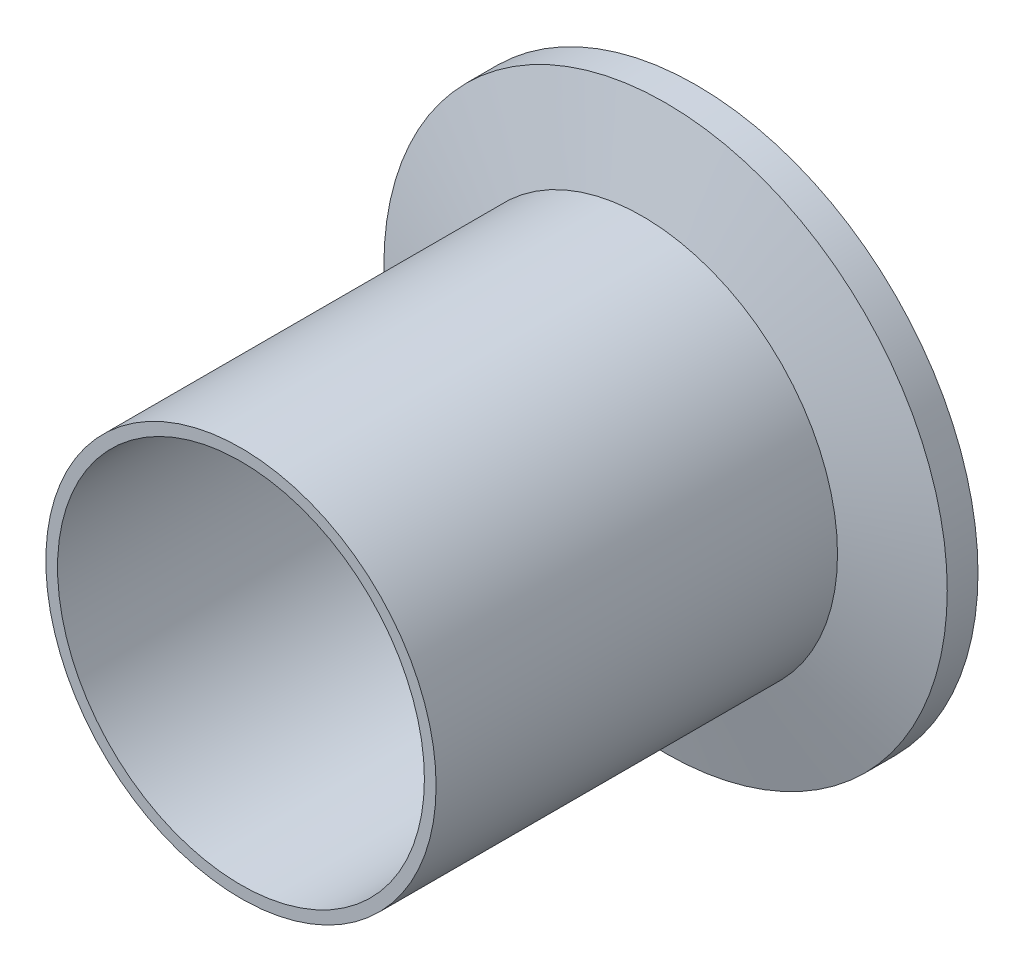
ISO-10303-21;
HEADER;
FILE_DESCRIPTION(('STEP AP214'),'2;1');
FILE_NAME('part.step','',(''),(''),'','','');
FILE_SCHEMA(('AUTOMOTIVE_DESIGN { 1 0 10303 214 1 1 1 1 }'));
ENDSEC;
DATA;
#1=APPLICATION_CONTEXT('core data for automotive mechanical design processes');
#2=APPLICATION_PROTOCOL_DEFINITION('international standard','automotive_design',2000,#1);
#3=PRODUCT_CONTEXT('',#1,'mechanical');
#4=PRODUCT('Part','Part','',(#3));
#5=PRODUCT_RELATED_PRODUCT_CATEGORY('part','',(#4));
#6=PRODUCT_DEFINITION_FORMATION('','',#4);
#7=PRODUCT_DEFINITION_CONTEXT('part definition',#1,'design');
#8=PRODUCT_DEFINITION('design','',#6,#7);
#9=PRODUCT_DEFINITION_SHAPE('','',#8);
#10=(LENGTH_UNIT() NAMED_UNIT(*) SI_UNIT(.MILLI.,.METRE.));
#11=(NAMED_UNIT(*) PLANE_ANGLE_UNIT() SI_UNIT($,.RADIAN.));
#12=(NAMED_UNIT(*) SI_UNIT($,.STERADIAN.) SOLID_ANGLE_UNIT());
#13=UNCERTAINTY_MEASURE_WITH_UNIT(LENGTH_MEASURE(1.E-05),#10,'distance_accuracy_value','');
#14=(GEOMETRIC_REPRESENTATION_CONTEXT(3) GLOBAL_UNCERTAINTY_ASSIGNED_CONTEXT((#13)) GLOBAL_UNIT_ASSIGNED_CONTEXT((#10,
#11,#12)) REPRESENTATION_CONTEXT('',''));
#15=CARTESIAN_POINT('',(0.,0.,0.));
#16=DIRECTION('',(0.,0.,1.));
#17=DIRECTION('',(1.,0.,0.));
#18=AXIS2_PLACEMENT_3D('',#15,#16,#17);
#19=CARTESIAN_POINT('',(0.,0.,3.));
#20=DIRECTION('',(0.,0.,-1.));
#21=DIRECTION('',(-1.,0.,0.));
#22=AXIS2_PLACEMENT_3D('',#19,#20,#21);
#23=CONICAL_SURFACE('',#22,27.5,1.30899693899575);
#24=CARTESIAN_POINT('',(0.,0.,5.26417067604296));
#25=DIRECTION('',(0.,0.,1.));
#26=DIRECTION('',(1.,0.,0.));
#27=AXIS2_PLACEMENT_3D('',#24,#25,#26);
#28=CIRCLE('',#27,19.05);
#29=CARTESIAN_POINT('',(19.05,0.,5.26417067604296));
#30=VERTEX_POINT('',#29);
#31=EDGE_CURVE('E56',#30,#30,#28,.T.);
#32=ORIENTED_EDGE('',*,*,#31,.F.);
#33=EDGE_LOOP('',(#32));
#34=FACE_BOUND('',#33,.T.);
#35=CARTESIAN_POINT('',(0.,0.,3.));
#36=DIRECTION('',(0.,0.,1.));
#37=DIRECTION('',(1.,0.,0.));
#38=AXIS2_PLACEMENT_3D('',#35,#36,#37);
#39=CIRCLE('',#38,27.5);
#40=CARTESIAN_POINT('',(27.5,0.,3.));
#41=VERTEX_POINT('',#40);
#42=EDGE_CURVE('E10',#41,#41,#39,.T.);
#43=ORIENTED_EDGE('',*,*,#42,.T.);
#44=EDGE_LOOP('',(#43));
#45=FACE_BOUND('',#44,.T.);
#46=ADVANCED_FACE('F28',(#34,#45),#23,.T.);
#47=CARTESIAN_POINT('',(0.,0.,2.83330444951782));
#48=DIRECTION('',(0.,0.,1.));
#49=DIRECTION('',(1.,0.,0.));
#50=AXIS2_PLACEMENT_3D('',#47,#48,#49);
#51=CYLINDRICAL_SURFACE('',#50,27.5);
#52=ORIENTED_EDGE('',*,*,#42,.F.);
#53=EDGE_LOOP('',(#52));
#54=FACE_BOUND('',#53,.T.);
#55=CARTESIAN_POINT('',(0.,0.,0.));
#56=DIRECTION('',(0.,0.,1.));
#57=DIRECTION('',(1.,0.,0.));
#58=AXIS2_PLACEMENT_3D('',#55,#56,#57);
#59=CIRCLE('',#58,27.5);
#60=CARTESIAN_POINT('',(27.5,0.,0.));
#61=VERTEX_POINT('',#60);
#62=EDGE_CURVE('E34',#61,#61,#59,.T.);
#63=ORIENTED_EDGE('',*,*,#62,.T.);
#64=EDGE_LOOP('',(#63));
#65=FACE_BOUND('',#64,.T.);
#66=ADVANCED_FACE('F63',(#54,#65),#51,.T.);
#67=CARTESIAN_POINT('',(0.,27.5,0.));
#68=DIRECTION('',(0.,0.,1.));
#69=DIRECTION('',(1.,0.,0.));
#70=AXIS2_PLACEMENT_3D('',#67,#68,#69);
#71=PLANE('',#70);
#72=ORIENTED_EDGE('',*,*,#62,.F.);
#73=EDGE_LOOP('',(#72));
#74=FACE_BOUND('',#73,.T.);
#75=CARTESIAN_POINT('',(0.,0.,0.));
#76=DIRECTION('',(0.,0.,1.));
#77=DIRECTION('',(1.,0.,0.));
#78=AXIS2_PLACEMENT_3D('',#75,#76,#77);
#79=CIRCLE('',#78,20.6);
#80=CARTESIAN_POINT('',(20.6,0.,0.));
#81=VERTEX_POINT('',#80);
#82=EDGE_CURVE('E38',#81,#81,#79,.T.);
#83=ORIENTED_EDGE('',*,*,#82,.T.);
#84=EDGE_LOOP('',(#83));
#85=FACE_BOUND('',#84,.T.);
#86=ADVANCED_FACE('F67',(#74,#85),#71,.F.);
#87=CARTESIAN_POINT('',(0.,0.,2.83330444951782));
#88=DIRECTION('',(0.,0.,1.));
#89=DIRECTION('',(1.,0.,0.));
#90=AXIS2_PLACEMENT_3D('',#87,#88,#89);
#91=CYLINDRICAL_SURFACE('',#90,20.6);
#92=ORIENTED_EDGE('',*,*,#82,.F.);
#93=EDGE_LOOP('',(#92));
#94=FACE_BOUND('',#93,.T.);
#95=CARTESIAN_POINT('',(0.,0.,2.5));
#96=DIRECTION('',(0.,0.,1.));
#97=DIRECTION('',(1.,0.,0.));
#98=AXIS2_PLACEMENT_3D('',#95,#96,#97);
#99=CIRCLE('',#98,20.6);
#100=CARTESIAN_POINT('',(20.6,0.,2.5));
#101=VERTEX_POINT('',#100);
#102=EDGE_CURVE('E42',#101,#101,#99,.T.);
#103=ORIENTED_EDGE('',*,*,#102,.T.);
#104=EDGE_LOOP('',(#103));
#105=FACE_BOUND('',#104,.T.);
#106=ADVANCED_FACE('F72',(#94,#105),#91,.F.);
#107=CARTESIAN_POINT('',(0.,20.6,2.5));
#108=DIRECTION('',(0.,0.,1.));
#109=DIRECTION('',(1.,0.,0.));
#110=AXIS2_PLACEMENT_3D('',#107,#108,#109);
#111=PLANE('',#110);
#112=ORIENTED_EDGE('',*,*,#102,.F.);
#113=EDGE_LOOP('',(#112));
#114=FACE_BOUND('',#113,.T.);
#115=CARTESIAN_POINT('',(0.,0.,2.5));
#116=DIRECTION('',(0.,0.,1.));
#117=DIRECTION('',(1.,0.,0.));
#118=AXIS2_PLACEMENT_3D('',#115,#116,#117);
#119=CIRCLE('',#118,17.907);
#120=CARTESIAN_POINT('',(17.907,0.,2.5));
#121=VERTEX_POINT('',#120);
#122=EDGE_CURVE('E47',#121,#121,#119,.T.);
#123=ORIENTED_EDGE('',*,*,#122,.T.);
#124=EDGE_LOOP('',(#123));
#125=FACE_BOUND('',#124,.T.);
#126=ADVANCED_FACE('F78',(#114,#125),#111,.F.);
#127=CARTESIAN_POINT('',(0.,0.,2.83330444951782));
#128=DIRECTION('',(0.,0.,1.));
#129=DIRECTION('',(1.,0.,0.));
#130=AXIS2_PLACEMENT_3D('',#127,#128,#129);
#131=CYLINDRICAL_SURFACE('',#130,17.907);
#132=ORIENTED_EDGE('',*,*,#122,.F.);
#133=EDGE_LOOP('',(#132));
#134=FACE_BOUND('',#133,.T.);
#135=CARTESIAN_POINT('',(0.,0.,44.45));
#136=DIRECTION('',(0.,0.,1.));
#137=DIRECTION('',(1.,0.,0.));
#138=AXIS2_PLACEMENT_3D('',#135,#136,#137);
#139=CIRCLE('',#138,17.907);
#140=CARTESIAN_POINT('',(17.907,0.,44.45));
#141=VERTEX_POINT('',#140);
#142=EDGE_CURVE('E50',#141,#141,#139,.T.);
#143=ORIENTED_EDGE('',*,*,#142,.T.);
#144=EDGE_LOOP('',(#143));
#145=FACE_BOUND('',#144,.T.);
#146=ADVANCED_FACE('F82',(#134,#145),#131,.F.);
#147=CARTESIAN_POINT('',(0.,17.907,44.45));
#148=DIRECTION('',(0.,0.,-1.));
#149=DIRECTION('',(-1.,0.,0.));
#150=AXIS2_PLACEMENT_3D('',#147,#148,#149);
#151=PLANE('',#150);
#152=ORIENTED_EDGE('',*,*,#142,.F.);
#153=EDGE_LOOP('',(#152));
#154=FACE_BOUND('',#153,.T.);
#155=CARTESIAN_POINT('',(0.,0.,44.45));
#156=DIRECTION('',(0.,0.,1.));
#157=DIRECTION('',(1.,0.,0.));
#158=AXIS2_PLACEMENT_3D('',#155,#156,#157);
#159=CIRCLE('',#158,19.05);
#160=CARTESIAN_POINT('',(19.05,0.,44.45));
#161=VERTEX_POINT('',#160);
#162=EDGE_CURVE('E53',#161,#161,#159,.T.);
#163=ORIENTED_EDGE('',*,*,#162,.T.);
#164=EDGE_LOOP('',(#163));
#165=FACE_BOUND('',#164,.T.);
#166=ADVANCED_FACE('F86',(#154,#165),#151,.F.);
#167=CARTESIAN_POINT('',(0.,0.,2.83330444951782));
#168=DIRECTION('',(0.,0.,1.));
#169=DIRECTION('',(1.,0.,0.));
#170=AXIS2_PLACEMENT_3D('',#167,#168,#169);
#171=CYLINDRICAL_SURFACE('',#170,19.05);
#172=ORIENTED_EDGE('',*,*,#162,.F.);
#173=EDGE_LOOP('',(#172));
#174=FACE_BOUND('',#173,.T.);
#175=ORIENTED_EDGE('',*,*,#31,.T.);
#176=EDGE_LOOP('',(#175));
#177=FACE_BOUND('',#176,.T.);
#178=ADVANCED_FACE('F60',(#174,#177),#171,.T.);
#179=CLOSED_SHELL('',(#46,#66,#86,#106,#126,#146,#166,#178));
#180=MANIFOLD_SOLID_BREP('B2',#179);
#181=ADVANCED_BREP_SHAPE_REPRESENTATION('',(#18,#180),#14);
#182=SHAPE_DEFINITION_REPRESENTATION(#9,#181);
ENDSEC;
END-ISO-10303-21;
